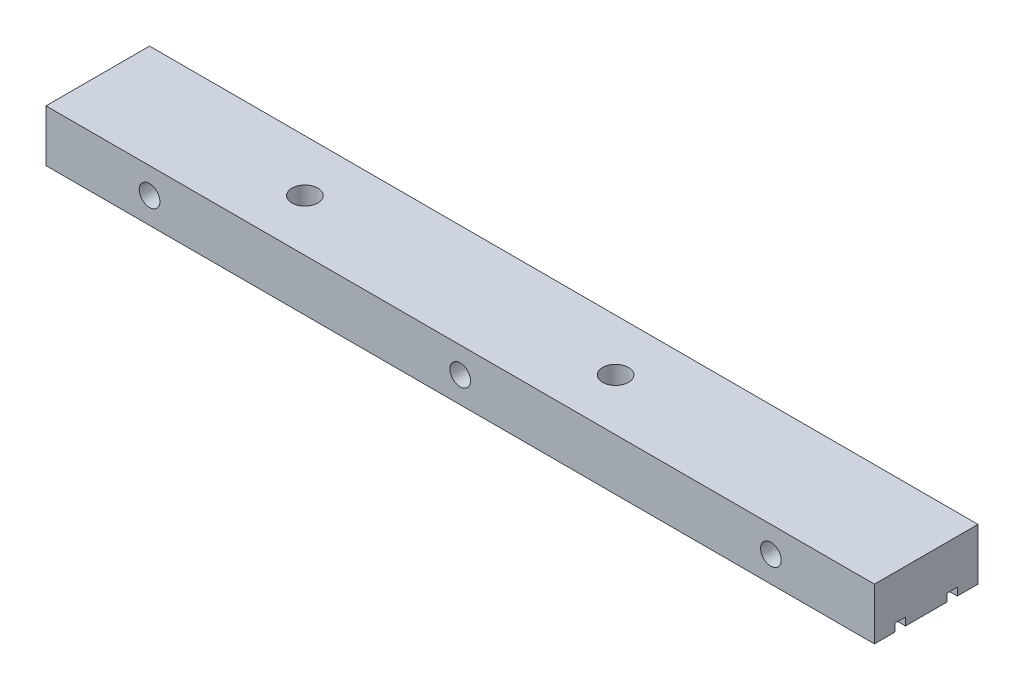
ISO-10303-21;
HEADER;
FILE_DESCRIPTION(('STEP AP214'),'2;1');
FILE_NAME('part.step','',(''),(''),'','','');
FILE_SCHEMA(('AUTOMOTIVE_DESIGN { 1 0 10303 214 1 1 1 1 }'));
ENDSEC;
DATA;
#1=APPLICATION_CONTEXT('core data for automotive mechanical design processes');
#2=APPLICATION_PROTOCOL_DEFINITION('international standard','automotive_design',2000,#1);
#3=PRODUCT_CONTEXT('',#1,'mechanical');
#4=PRODUCT('Part','Part','',(#3));
#5=PRODUCT_RELATED_PRODUCT_CATEGORY('part','',(#4));
#6=PRODUCT_DEFINITION_FORMATION('','',#4);
#7=PRODUCT_DEFINITION_CONTEXT('part definition',#1,'design');
#8=PRODUCT_DEFINITION('design','',#6,#7);
#9=PRODUCT_DEFINITION_SHAPE('','',#8);
#10=(LENGTH_UNIT() NAMED_UNIT(*) SI_UNIT(.MILLI.,.METRE.));
#11=(NAMED_UNIT(*) PLANE_ANGLE_UNIT() SI_UNIT($,.RADIAN.));
#12=(NAMED_UNIT(*) SI_UNIT($,.STERADIAN.) SOLID_ANGLE_UNIT());
#13=UNCERTAINTY_MEASURE_WITH_UNIT(LENGTH_MEASURE(1.E-05),#10,'distance_accuracy_value','');
#14=(GEOMETRIC_REPRESENTATION_CONTEXT(3) GLOBAL_UNCERTAINTY_ASSIGNED_CONTEXT((#13)) GLOBAL_UNIT_ASSIGNED_CONTEXT((#10,
#11,#12)) REPRESENTATION_CONTEXT('',''));
#15=CARTESIAN_POINT('',(0.,0.,0.));
#16=DIRECTION('',(0.,0.,1.));
#17=DIRECTION('',(1.,0.,0.));
#18=AXIS2_PLACEMENT_3D('',#15,#16,#17);
#19=CARTESIAN_POINT('',(0.,0.,20.));
#20=DIRECTION('',(0.,1.,0.));
#21=DIRECTION('',(0.,0.,1.));
#22=AXIS2_PLACEMENT_3D('',#19,#20,#21);
#23=PLANE('',#22);
#24=DIRECTION('',(0.,0.,-1.));
#25=VECTOR('',#24,1.);
#26=CARTESIAN_POINT('',(160.,0.,20.));
#27=LINE('',#26,#25);
#28=CARTESIAN_POINT('',(160.,0.,4.));
#29=VERTEX_POINT('',#28);
#30=CARTESIAN_POINT('',(160.,0.,0.));
#31=VERTEX_POINT('',#30);
#32=EDGE_CURVE('E140',#29,#31,#27,.T.);
#33=ORIENTED_EDGE('',*,*,#32,.F.);
#34=DIRECTION('',(-1.,0.,0.));
#35=VECTOR('',#34,1.);
#36=CARTESIAN_POINT('',(160.,0.,4.));
#37=LINE('',#36,#35);
#38=CARTESIAN_POINT('',(0.,0.,4.));
#39=VERTEX_POINT('',#38);
#40=EDGE_CURVE('E127',#29,#39,#37,.T.);
#41=ORIENTED_EDGE('',*,*,#40,.T.);
#42=DIRECTION('',(0.,0.,-1.));
#43=VECTOR('',#42,1.);
#44=CARTESIAN_POINT('',(0.,0.,20.));
#45=LINE('',#44,#43);
#46=CARTESIAN_POINT('',(0.,0.,0.));
#47=VERTEX_POINT('',#46);
#48=EDGE_CURVE('E46',#39,#47,#45,.T.);
#49=ORIENTED_EDGE('',*,*,#48,.T.);
#50=DIRECTION('',(1.,0.,0.));
#51=VECTOR('',#50,1.);
#52=CARTESIAN_POINT('',(0.,0.,0.));
#53=LINE('',#52,#51);
#54=EDGE_CURVE('E147',#47,#31,#53,.T.);
#55=ORIENTED_EDGE('',*,*,#54,.T.);
#56=EDGE_LOOP('',(#33,#41,#49,#55));
#57=FACE_BOUND('',#56,.T.);
#58=ADVANCED_FACE('F37',(#57),#23,.F.);
#59=CARTESIAN_POINT('',(0.,0.,14.));
#60=VERTEX_POINT('',#59);
#61=CARTESIAN_POINT('',(0.,0.,6.));
#62=VERTEX_POINT('',#61);
#63=EDGE_CURVE('E45',#60,#62,#45,.T.);
#64=ORIENTED_EDGE('',*,*,#63,.T.);
#65=DIRECTION('',(-1.,0.,0.));
#66=VECTOR('',#65,1.);
#67=CARTESIAN_POINT('',(160.,0.,6.));
#68=LINE('',#67,#66);
#69=CARTESIAN_POINT('',(160.,0.,6.));
#70=VERTEX_POINT('',#69);
#71=EDGE_CURVE('E136',#70,#62,#68,.T.);
#72=ORIENTED_EDGE('',*,*,#71,.F.);
#73=CARTESIAN_POINT('',(160.,0.,14.));
#74=VERTEX_POINT('',#73);
#75=EDGE_CURVE('E149',#74,#70,#27,.T.);
#76=ORIENTED_EDGE('',*,*,#75,.F.);
#77=DIRECTION('',(-1.,0.,0.));
#78=VECTOR('',#77,1.);
#79=CARTESIAN_POINT('',(160.,0.,14.));
#80=LINE('',#79,#78);
#81=EDGE_CURVE('E167',#74,#60,#80,.T.);
#82=ORIENTED_EDGE('',*,*,#81,.T.);
#83=EDGE_LOOP('',(#64,#72,#76,#82));
#84=FACE_BOUND('',#83,.T.);
#85=ADVANCED_FACE('F165',(#84),#23,.F.);
#86=CARTESIAN_POINT('',(0.,0.,20.));
#87=DIRECTION('',(1.,0.,0.));
#88=DIRECTION('',(0.,0.,-1.));
#89=AXIS2_PLACEMENT_3D('',#86,#87,#88);
#90=PLANE('',#89);
#91=ORIENTED_EDGE('',*,*,#48,.F.);
#92=DIRECTION('',(0.,-1.,0.));
#93=VECTOR('',#92,1.);
#94=CARTESIAN_POINT('',(0.,0.,4.));
#95=LINE('',#94,#93);
#96=CARTESIAN_POINT('',(0.,1.5,4.));
#97=VERTEX_POINT('',#96);
#98=EDGE_CURVE('E132',#97,#39,#95,.T.);
#99=ORIENTED_EDGE('',*,*,#98,.F.);
#100=DIRECTION('',(0.,0.,-1.));
#101=VECTOR('',#100,1.);
#102=CARTESIAN_POINT('',(0.,1.5,4.));
#103=LINE('',#102,#101);
#104=CARTESIAN_POINT('',(0.,1.5,6.));
#105=VERTEX_POINT('',#104);
#106=EDGE_CURVE('E144',#105,#97,#103,.T.);
#107=ORIENTED_EDGE('',*,*,#106,.F.);
#108=DIRECTION('',(0.,1.,0.));
#109=VECTOR('',#108,1.);
#110=CARTESIAN_POINT('',(0.,0.,6.));
#111=LINE('',#110,#109);
#112=EDGE_CURVE('E175',#62,#105,#111,.T.);
#113=ORIENTED_EDGE('',*,*,#112,.F.);
#114=ORIENTED_EDGE('',*,*,#63,.F.);
#115=DIRECTION('',(0.,-1.,0.));
#116=VECTOR('',#115,1.);
#117=CARTESIAN_POINT('',(0.,0.,14.));
#118=LINE('',#117,#116);
#119=CARTESIAN_POINT('',(0.,1.5,14.));
#120=VERTEX_POINT('',#119);
#121=EDGE_CURVE('E172',#120,#60,#118,.T.);
#122=ORIENTED_EDGE('',*,*,#121,.F.);
#123=DIRECTION('',(0.,0.,-1.));
#124=VECTOR('',#123,1.);
#125=CARTESIAN_POINT('',(0.,1.5,14.));
#126=LINE('',#125,#124);
#127=CARTESIAN_POINT('',(0.,1.5,16.));
#128=VERTEX_POINT('',#127);
#129=EDGE_CURVE('E194',#128,#120,#126,.T.);
#130=ORIENTED_EDGE('',*,*,#129,.F.);
#131=DIRECTION('',(0.,1.,0.));
#132=VECTOR('',#131,1.);
#133=CARTESIAN_POINT('',(0.,0.,16.));
#134=LINE('',#133,#132);
#135=CARTESIAN_POINT('',(0.,0.,16.));
#136=VERTEX_POINT('',#135);
#137=EDGE_CURVE('E198',#136,#128,#134,.T.);
#138=ORIENTED_EDGE('',*,*,#137,.F.);
#139=CARTESIAN_POINT('',(0.,0.,20.));
#140=VERTEX_POINT('',#139);
#141=EDGE_CURVE('E11',#140,#136,#45,.T.);
#142=ORIENTED_EDGE('',*,*,#141,.F.);
#143=DIRECTION('',(0.,-1.,0.));
#144=VECTOR('',#143,1.);
#145=CARTESIAN_POINT('',(0.,0.,20.));
#146=LINE('',#145,#144);
#147=CARTESIAN_POINT('',(0.,10.,20.));
#148=VERTEX_POINT('',#147);
#149=EDGE_CURVE('E222',#148,#140,#146,.T.);
#150=ORIENTED_EDGE('',*,*,#149,.F.);
#151=DIRECTION('',(0.,0.,-1.));
#152=VECTOR('',#151,1.);
#153=CARTESIAN_POINT('',(0.,10.,20.));
#154=LINE('',#153,#152);
#155=CARTESIAN_POINT('',(0.,10.,0.));
#156=VERTEX_POINT('',#155);
#157=EDGE_CURVE('E154',#148,#156,#154,.T.);
#158=ORIENTED_EDGE('',*,*,#157,.T.);
#159=DIRECTION('',(0.,-1.,0.));
#160=VECTOR('',#159,1.);
#161=CARTESIAN_POINT('',(0.,0.,0.));
#162=LINE('',#161,#160);
#163=EDGE_CURVE('E221',#156,#47,#162,.T.);
#164=ORIENTED_EDGE('',*,*,#163,.T.);
#165=EDGE_LOOP('',(#91,#99,#107,#113,#114,#122,#130,#138,#142,#150,#158,#164));
#166=FACE_BOUND('',#165,.T.);
#167=ADVANCED_FACE('F39',(#166),#90,.F.);
#168=ORIENTED_EDGE('',*,*,#141,.T.);
#169=DIRECTION('',(-1.,0.,0.));
#170=VECTOR('',#169,1.);
#171=CARTESIAN_POINT('',(160.,0.,16.));
#172=LINE('',#171,#170);
#173=CARTESIAN_POINT('',(160.,0.,16.));
#174=VERTEX_POINT('',#173);
#175=EDGE_CURVE('E207',#174,#136,#172,.T.);
#176=ORIENTED_EDGE('',*,*,#175,.F.);
#177=CARTESIAN_POINT('',(160.,0.,20.));
#178=VERTEX_POINT('',#177);
#179=EDGE_CURVE('E151',#178,#174,#27,.T.);
#180=ORIENTED_EDGE('',*,*,#179,.F.);
#181=DIRECTION('',(1.,0.,0.));
#182=VECTOR('',#181,1.);
#183=CARTESIAN_POINT('',(0.,0.,20.));
#184=LINE('',#183,#182);
#185=EDGE_CURVE('E225',#140,#178,#184,.T.);
#186=ORIENTED_EDGE('',*,*,#185,.F.);
#187=EDGE_LOOP('',(#168,#176,#180,#186));
#188=FACE_BOUND('',#187,.T.);
#189=ADVANCED_FACE('F254',(#188),#23,.F.);
#190=CARTESIAN_POINT('',(160.,0.,20.));
#191=DIRECTION('',(-1.,0.,0.));
#192=DIRECTION('',(0.,0.,1.));
#193=AXIS2_PLACEMENT_3D('',#190,#191,#192);
#194=PLANE('',#193);
#195=DIRECTION('',(0.,0.,-1.));
#196=VECTOR('',#195,1.);
#197=CARTESIAN_POINT('',(160.,1.5,4.));
#198=LINE('',#197,#196);
#199=CARTESIAN_POINT('',(160.,1.5,6.));
#200=VERTEX_POINT('',#199);
#201=CARTESIAN_POINT('',(160.,1.5,4.));
#202=VERTEX_POINT('',#201);
#203=EDGE_CURVE('E53',#200,#202,#198,.T.);
#204=ORIENTED_EDGE('',*,*,#203,.T.);
#205=DIRECTION('',(0.,-1.,0.));
#206=VECTOR('',#205,1.);
#207=CARTESIAN_POINT('',(160.,0.,4.));
#208=LINE('',#207,#206);
#209=EDGE_CURVE('E130',#202,#29,#208,.T.);
#210=ORIENTED_EDGE('',*,*,#209,.T.);
#211=ORIENTED_EDGE('',*,*,#32,.T.);
#212=DIRECTION('',(0.,1.,0.));
#213=VECTOR('',#212,1.);
#214=CARTESIAN_POINT('',(160.,0.,0.));
#215=LINE('',#214,#213);
#216=CARTESIAN_POINT('',(160.,10.,0.));
#217=VERTEX_POINT('',#216);
#218=EDGE_CURVE('E235',#31,#217,#215,.T.);
#219=ORIENTED_EDGE('',*,*,#218,.T.);
#220=DIRECTION('',(0.,0.,-1.));
#221=VECTOR('',#220,1.);
#222=CARTESIAN_POINT('',(160.,10.,20.));
#223=LINE('',#222,#221);
#224=CARTESIAN_POINT('',(160.,10.,20.));
#225=VERTEX_POINT('',#224);
#226=EDGE_CURVE('E150',#225,#217,#223,.T.);
#227=ORIENTED_EDGE('',*,*,#226,.F.);
#228=DIRECTION('',(0.,1.,0.));
#229=VECTOR('',#228,1.);
#230=CARTESIAN_POINT('',(160.,0.,20.));
#231=LINE('',#230,#229);
#232=EDGE_CURVE('E228',#178,#225,#231,.T.);
#233=ORIENTED_EDGE('',*,*,#232,.F.);
#234=ORIENTED_EDGE('',*,*,#179,.T.);
#235=DIRECTION('',(0.,1.,0.));
#236=VECTOR('',#235,1.);
#237=CARTESIAN_POINT('',(160.,0.,16.));
#238=LINE('',#237,#236);
#239=CARTESIAN_POINT('',(160.,1.5,16.));
#240=VERTEX_POINT('',#239);
#241=EDGE_CURVE('E193',#174,#240,#238,.T.);
#242=ORIENTED_EDGE('',*,*,#241,.T.);
#243=DIRECTION('',(0.,0.,-1.));
#244=VECTOR('',#243,1.);
#245=CARTESIAN_POINT('',(160.,1.5,14.));
#246=LINE('',#245,#244);
#247=CARTESIAN_POINT('',(160.,1.5,14.));
#248=VERTEX_POINT('',#247);
#249=EDGE_CURVE('E61',#240,#248,#246,.T.);
#250=ORIENTED_EDGE('',*,*,#249,.T.);
#251=DIRECTION('',(0.,-1.,0.));
#252=VECTOR('',#251,1.);
#253=CARTESIAN_POINT('',(160.,0.,14.));
#254=LINE('',#253,#252);
#255=EDGE_CURVE('E190',#248,#74,#254,.T.);
#256=ORIENTED_EDGE('',*,*,#255,.T.);
#257=ORIENTED_EDGE('',*,*,#75,.T.);
#258=DIRECTION('',(0.,1.,0.));
#259=VECTOR('',#258,1.);
#260=CARTESIAN_POINT('',(160.,0.,6.));
#261=LINE('',#260,#259);
#262=EDGE_CURVE('E143',#70,#200,#261,.T.);
#263=ORIENTED_EDGE('',*,*,#262,.T.);
#264=EDGE_LOOP('',(#204,#210,#211,#219,#227,#233,#234,#242,#250,#256,#257,#263));
#265=FACE_BOUND('',#264,.T.);
#266=ADVANCED_FACE('F139',(#265),#194,.F.);
#267=CARTESIAN_POINT('',(0.,10.,20.));
#268=DIRECTION('',(0.,-1.,0.));
#269=DIRECTION('',(0.,0.,-1.));
#270=AXIS2_PLACEMENT_3D('',#267,#268,#269);
#271=PLANE('',#270);
#272=CARTESIAN_POINT('',(40.,9.99999999999999,10.));
#273=DIRECTION('',(0.,1.,0.));
#274=DIRECTION('',(0.,0.,1.));
#275=AXIS2_PLACEMENT_3D('',#272,#273,#274);
#276=CIRCLE('',#275,2.5);
#277=CARTESIAN_POINT('',(40.,9.99999999999999,12.5));
#278=VERTEX_POINT('',#277);
#279=EDGE_CURVE('E186',#278,#278,#276,.T.);
#280=ORIENTED_EDGE('',*,*,#279,.F.);
#281=EDGE_LOOP('',(#280));
#282=FACE_BOUND('',#281,.T.);
#283=CARTESIAN_POINT('',(100.,9.99999999999999,10.));
#284=DIRECTION('',(0.,1.,0.));
#285=DIRECTION('',(0.,0.,1.));
#286=AXIS2_PLACEMENT_3D('',#283,#284,#285);
#287=CIRCLE('',#286,2.5);
#288=CARTESIAN_POINT('',(100.,9.99999999999999,12.5));
#289=VERTEX_POINT('',#288);
#290=EDGE_CURVE('E215',#289,#289,#287,.T.);
#291=ORIENTED_EDGE('',*,*,#290,.F.);
#292=EDGE_LOOP('',(#291));
#293=FACE_BOUND('',#292,.T.);
#294=DIRECTION('',(-1.,0.,0.));
#295=VECTOR('',#294,1.);
#296=CARTESIAN_POINT('',(0.,10.,0.));
#297=LINE('',#296,#295);
#298=EDGE_CURVE('E226',#217,#156,#297,.T.);
#299=ORIENTED_EDGE('',*,*,#298,.T.);
#300=ORIENTED_EDGE('',*,*,#157,.F.);
#301=DIRECTION('',(-1.,0.,0.));
#302=VECTOR('',#301,1.);
#303=CARTESIAN_POINT('',(0.,10.,20.));
#304=LINE('',#303,#302);
#305=EDGE_CURVE('E230',#225,#148,#304,.T.);
#306=ORIENTED_EDGE('',*,*,#305,.F.);
#307=ORIENTED_EDGE('',*,*,#226,.T.);
#308=EDGE_LOOP('',(#299,#300,#306,#307));
#309=FACE_BOUND('',#308,.T.);
#310=ADVANCED_FACE('F249',(#282,#293,#309),#271,.F.);
#311=CARTESIAN_POINT('',(0.,0.,20.));
#312=DIRECTION('',(0.,0.,-1.));
#313=DIRECTION('',(-1.,0.,0.));
#314=AXIS2_PLACEMENT_3D('',#311,#312,#313);
#315=PLANE('',#314);
#316=CARTESIAN_POINT('',(140.,5.,20.));
#317=DIRECTION('',(0.,0.,-1.));
#318=DIRECTION('',(-1.,0.,0.));
#319=AXIS2_PLACEMENT_3D('',#316,#317,#318);
#320=CIRCLE('',#319,2.);
#321=CARTESIAN_POINT('',(138.,5.,20.));
#322=VERTEX_POINT('',#321);
#323=EDGE_CURVE('E530',#322,#322,#320,.T.);
#324=ORIENTED_EDGE('',*,*,#323,.T.);
#325=EDGE_LOOP('',(#324));
#326=FACE_BOUND('',#325,.T.);
#327=CARTESIAN_POINT('',(80.,5.,20.));
#328=DIRECTION('',(0.,0.,-1.));
#329=DIRECTION('',(-1.,0.,0.));
#330=AXIS2_PLACEMENT_3D('',#327,#328,#329);
#331=CIRCLE('',#330,1.99999999999999);
#332=CARTESIAN_POINT('',(78.,5.,20.));
#333=VERTEX_POINT('',#332);
#334=EDGE_CURVE('E518',#333,#333,#331,.T.);
#335=ORIENTED_EDGE('',*,*,#334,.T.);
#336=EDGE_LOOP('',(#335));
#337=FACE_BOUND('',#336,.T.);
#338=CARTESIAN_POINT('',(20.,5.,20.));
#339=DIRECTION('',(0.,0.,-1.));
#340=DIRECTION('',(-1.,0.,0.));
#341=AXIS2_PLACEMENT_3D('',#338,#339,#340);
#342=CIRCLE('',#341,1.99999999999999);
#343=CARTESIAN_POINT('',(18.,5.,20.));
#344=VERTEX_POINT('',#343);
#345=EDGE_CURVE('E199',#344,#344,#342,.T.);
#346=ORIENTED_EDGE('',*,*,#345,.T.);
#347=EDGE_LOOP('',(#346));
#348=FACE_BOUND('',#347,.T.);
#349=ORIENTED_EDGE('',*,*,#149,.T.);
#350=ORIENTED_EDGE('',*,*,#185,.T.);
#351=ORIENTED_EDGE('',*,*,#232,.T.);
#352=ORIENTED_EDGE('',*,*,#305,.T.);
#353=EDGE_LOOP('',(#349,#350,#351,#352));
#354=FACE_BOUND('',#353,.T.);
#355=ADVANCED_FACE('F251',(#326,#337,#348,#354),#315,.F.);
#356=CARTESIAN_POINT('',(0.,0.,0.));
#357=DIRECTION('',(0.,0.,-1.));
#358=DIRECTION('',(-1.,0.,0.));
#359=AXIS2_PLACEMENT_3D('',#356,#357,#358);
#360=PLANE('',#359);
#361=CARTESIAN_POINT('',(140.,5.,0.));
#362=DIRECTION('',(0.,0.,-1.));
#363=DIRECTION('',(-1.,0.,0.));
#364=AXIS2_PLACEMENT_3D('',#361,#362,#363);
#365=CIRCLE('',#364,3.25);
#366=CARTESIAN_POINT('',(136.75,5.,0.));
#367=VERTEX_POINT('',#366);
#368=EDGE_CURVE('E539',#367,#367,#365,.T.);
#369=ORIENTED_EDGE('',*,*,#368,.F.);
#370=EDGE_LOOP('',(#369));
#371=FACE_BOUND('',#370,.T.);
#372=CARTESIAN_POINT('',(80.,5.,0.));
#373=DIRECTION('',(0.,0.,-1.));
#374=DIRECTION('',(-1.,0.,0.));
#375=AXIS2_PLACEMENT_3D('',#372,#373,#374);
#376=CIRCLE('',#375,3.25);
#377=CARTESIAN_POINT('',(76.75,5.,0.));
#378=VERTEX_POINT('',#377);
#379=EDGE_CURVE('E527',#378,#378,#376,.T.);
#380=ORIENTED_EDGE('',*,*,#379,.F.);
#381=EDGE_LOOP('',(#380));
#382=FACE_BOUND('',#381,.T.);
#383=CARTESIAN_POINT('',(20.,5.,0.));
#384=DIRECTION('',(0.,0.,-1.));
#385=DIRECTION('',(-1.,0.,0.));
#386=AXIS2_PLACEMENT_3D('',#383,#384,#385);
#387=CIRCLE('',#386,3.25);
#388=CARTESIAN_POINT('',(16.75,5.,0.));
#389=VERTEX_POINT('',#388);
#390=EDGE_CURVE('E515',#389,#389,#387,.T.);
#391=ORIENTED_EDGE('',*,*,#390,.F.);
#392=EDGE_LOOP('',(#391));
#393=FACE_BOUND('',#392,.T.);
#394=ORIENTED_EDGE('',*,*,#163,.F.);
#395=ORIENTED_EDGE('',*,*,#298,.F.);
#396=ORIENTED_EDGE('',*,*,#218,.F.);
#397=ORIENTED_EDGE('',*,*,#54,.F.);
#398=EDGE_LOOP('',(#394,#395,#396,#397));
#399=FACE_BOUND('',#398,.T.);
#400=ADVANCED_FACE('F247',(#371,#382,#393,#399),#360,.T.);
#401=CARTESIAN_POINT('',(100.,1.99999999999999,10.));
#402=DIRECTION('',(0.,-1.,0.));
#403=DIRECTION('',(0.,0.,-1.));
#404=AXIS2_PLACEMENT_3D('',#401,#402,#403);
#405=PLANE('',#404);
#406=CARTESIAN_POINT('',(100.,1.99999999999999,10.));
#407=DIRECTION('',(0.,1.,0.));
#408=DIRECTION('',(0.,0.,1.));
#409=AXIS2_PLACEMENT_3D('',#406,#407,#408);
#410=CIRCLE('',#409,2.5);
#411=CARTESIAN_POINT('',(100.,1.99999999999999,12.5));
#412=VERTEX_POINT('',#411);
#413=EDGE_CURVE('E218',#412,#412,#410,.T.);
#414=ORIENTED_EDGE('',*,*,#413,.T.);
#415=EDGE_LOOP('',(#414));
#416=FACE_BOUND('',#415,.T.);
#417=ADVANCED_FACE('F320',(#416),#405,.F.);
#418=CARTESIAN_POINT('',(100.,9.99999999999999,10.));
#419=DIRECTION('',(0.,1.,0.));
#420=DIRECTION('',(0.,0.,1.));
#421=AXIS2_PLACEMENT_3D('',#418,#419,#420);
#422=CYLINDRICAL_SURFACE('',#421,2.5);
#423=ORIENTED_EDGE('',*,*,#413,.F.);
#424=EDGE_LOOP('',(#423));
#425=FACE_BOUND('',#424,.T.);
#426=ORIENTED_EDGE('',*,*,#290,.T.);
#427=EDGE_LOOP('',(#426));
#428=FACE_BOUND('',#427,.T.);
#429=ADVANCED_FACE('F310',(#425,#428),#422,.F.);
#430=CARTESIAN_POINT('',(40.,1.99999999999999,10.));
#431=DIRECTION('',(0.,-1.,0.));
#432=DIRECTION('',(0.,0.,-1.));
#433=AXIS2_PLACEMENT_3D('',#430,#431,#432);
#434=PLANE('',#433);
#435=CARTESIAN_POINT('',(40.,1.99999999999999,10.));
#436=DIRECTION('',(0.,1.,0.));
#437=DIRECTION('',(0.,0.,1.));
#438=AXIS2_PLACEMENT_3D('',#435,#436,#437);
#439=CIRCLE('',#438,2.5);
#440=CARTESIAN_POINT('',(40.,1.99999999999999,12.5));
#441=VERTEX_POINT('',#440);
#442=EDGE_CURVE('E212',#441,#441,#439,.T.);
#443=ORIENTED_EDGE('',*,*,#442,.T.);
#444=EDGE_LOOP('',(#443));
#445=FACE_BOUND('',#444,.T.);
#446=ADVANCED_FACE('F270',(#445),#434,.F.);
#447=CARTESIAN_POINT('',(40.,9.99999999999999,10.));
#448=DIRECTION('',(0.,1.,0.));
#449=DIRECTION('',(0.,0.,1.));
#450=AXIS2_PLACEMENT_3D('',#447,#448,#449);
#451=CYLINDRICAL_SURFACE('',#450,2.5);
#452=ORIENTED_EDGE('',*,*,#442,.F.);
#453=EDGE_LOOP('',(#452));
#454=FACE_BOUND('',#453,.T.);
#455=ORIENTED_EDGE('',*,*,#279,.T.);
#456=EDGE_LOOP('',(#455));
#457=FACE_BOUND('',#456,.T.);
#458=ADVANCED_FACE('F263',(#454,#457),#451,.F.);
#459=CARTESIAN_POINT('',(160.,0.,14.));
#460=DIRECTION('',(0.,0.,-1.));
#461=DIRECTION('',(-1.,0.,0.));
#462=AXIS2_PLACEMENT_3D('',#459,#460,#461);
#463=PLANE('',#462);
#464=ORIENTED_EDGE('',*,*,#121,.T.);
#465=ORIENTED_EDGE('',*,*,#81,.F.);
#466=ORIENTED_EDGE('',*,*,#255,.F.);
#467=DIRECTION('',(-1.,0.,0.));
#468=VECTOR('',#467,1.);
#469=CARTESIAN_POINT('',(160.,1.5,14.));
#470=LINE('',#469,#468);
#471=EDGE_CURVE('E180',#248,#120,#470,.T.);
#472=ORIENTED_EDGE('',*,*,#471,.T.);
#473=EDGE_LOOP('',(#464,#465,#466,#472));
#474=FACE_BOUND('',#473,.T.);
#475=ADVANCED_FACE('F261',(#474),#463,.F.);
#476=CARTESIAN_POINT('',(160.,1.5,14.));
#477=DIRECTION('',(0.,1.,0.));
#478=DIRECTION('',(0.,0.,1.));
#479=AXIS2_PLACEMENT_3D('',#476,#477,#478);
#480=PLANE('',#479);
#481=ORIENTED_EDGE('',*,*,#129,.T.);
#482=ORIENTED_EDGE('',*,*,#471,.F.);
#483=ORIENTED_EDGE('',*,*,#249,.F.);
#484=DIRECTION('',(-1.,0.,0.));
#485=VECTOR('',#484,1.);
#486=CARTESIAN_POINT('',(160.,1.5,16.));
#487=LINE('',#486,#485);
#488=EDGE_CURVE('E205',#240,#128,#487,.T.);
#489=ORIENTED_EDGE('',*,*,#488,.T.);
#490=EDGE_LOOP('',(#481,#482,#483,#489));
#491=FACE_BOUND('',#490,.T.);
#492=ADVANCED_FACE('F258',(#491),#480,.F.);
#493=CARTESIAN_POINT('',(160.,0.,16.));
#494=DIRECTION('',(0.,0.,1.));
#495=DIRECTION('',(1.,0.,0.));
#496=AXIS2_PLACEMENT_3D('',#493,#494,#495);
#497=PLANE('',#496);
#498=ORIENTED_EDGE('',*,*,#137,.T.);
#499=ORIENTED_EDGE('',*,*,#488,.F.);
#500=ORIENTED_EDGE('',*,*,#241,.F.);
#501=ORIENTED_EDGE('',*,*,#175,.T.);
#502=EDGE_LOOP('',(#498,#499,#500,#501));
#503=FACE_BOUND('',#502,.T.);
#504=ADVANCED_FACE('F257',(#503),#497,.F.);
#505=CARTESIAN_POINT('',(160.,0.,4.));
#506=DIRECTION('',(0.,0.,-1.));
#507=DIRECTION('',(0.,1.,0.));
#508=AXIS2_PLACEMENT_3D('',#505,#506,#507);
#509=PLANE('',#508);
#510=ORIENTED_EDGE('',*,*,#98,.T.);
#511=ORIENTED_EDGE('',*,*,#40,.F.);
#512=ORIENTED_EDGE('',*,*,#209,.F.);
#513=DIRECTION('',(-1.,0.,0.));
#514=VECTOR('',#513,1.);
#515=CARTESIAN_POINT('',(160.,1.5,4.));
#516=LINE('',#515,#514);
#517=EDGE_CURVE('E184',#202,#97,#516,.T.);
#518=ORIENTED_EDGE('',*,*,#517,.T.);
#519=EDGE_LOOP('',(#510,#511,#512,#518));
#520=FACE_BOUND('',#519,.T.);
#521=ADVANCED_FACE('F129',(#520),#509,.F.);
#522=CARTESIAN_POINT('',(160.,1.5,4.));
#523=DIRECTION('',(0.,1.,0.));
#524=DIRECTION('',(0.,0.,1.));
#525=AXIS2_PLACEMENT_3D('',#522,#523,#524);
#526=PLANE('',#525);
#527=ORIENTED_EDGE('',*,*,#106,.T.);
#528=ORIENTED_EDGE('',*,*,#517,.F.);
#529=ORIENTED_EDGE('',*,*,#203,.F.);
#530=DIRECTION('',(-1.,0.,0.));
#531=VECTOR('',#530,1.);
#532=CARTESIAN_POINT('',(160.,1.5,6.));
#533=LINE('',#532,#531);
#534=EDGE_CURVE('E187',#200,#105,#533,.T.);
#535=ORIENTED_EDGE('',*,*,#534,.T.);
#536=EDGE_LOOP('',(#527,#528,#529,#535));
#537=FACE_BOUND('',#536,.T.);
#538=ADVANCED_FACE('F459',(#537),#526,.F.);
#539=CARTESIAN_POINT('',(160.,0.,6.));
#540=DIRECTION('',(0.,0.,1.));
#541=DIRECTION('',(0.,-1.,0.));
#542=AXIS2_PLACEMENT_3D('',#539,#540,#541);
#543=PLANE('',#542);
#544=ORIENTED_EDGE('',*,*,#112,.T.);
#545=ORIENTED_EDGE('',*,*,#534,.F.);
#546=ORIENTED_EDGE('',*,*,#262,.F.);
#547=ORIENTED_EDGE('',*,*,#71,.T.);
#548=EDGE_LOOP('',(#544,#545,#546,#547));
#549=FACE_BOUND('',#548,.T.);
#550=ADVANCED_FACE('F370',(#549),#543,.F.);
#551=CARTESIAN_POINT('',(20.,5.,0.));
#552=DIRECTION('',(0.,0.,-1.));
#553=DIRECTION('',(-1.,0.,0.));
#554=AXIS2_PLACEMENT_3D('',#551,#552,#553);
#555=CYLINDRICAL_SURFACE('',#554,2.);
#556=ORIENTED_EDGE('',*,*,#345,.F.);
#557=EDGE_LOOP('',(#556));
#558=FACE_BOUND('',#557,.T.);
#559=CARTESIAN_POINT('',(20.,5.,6.));
#560=DIRECTION('',(0.,0.,-1.));
#561=DIRECTION('',(-1.,0.,0.));
#562=AXIS2_PLACEMENT_3D('',#559,#560,#561);
#563=CIRCLE('',#562,2.);
#564=CARTESIAN_POINT('',(18.,5.,6.));
#565=VERTEX_POINT('',#564);
#566=EDGE_CURVE('E509',#565,#565,#563,.T.);
#567=ORIENTED_EDGE('',*,*,#566,.T.);
#568=EDGE_LOOP('',(#567));
#569=FACE_BOUND('',#568,.T.);
#570=ADVANCED_FACE('F364',(#558,#569),#555,.F.);
#571=CARTESIAN_POINT('',(22.,5.,6.));
#572=DIRECTION('',(0.,0.,1.));
#573=DIRECTION('',(1.,0.,0.));
#574=AXIS2_PLACEMENT_3D('',#571,#572,#573);
#575=PLANE('',#574);
#576=ORIENTED_EDGE('',*,*,#566,.F.);
#577=EDGE_LOOP('',(#576));
#578=FACE_BOUND('',#577,.T.);
#579=CARTESIAN_POINT('',(20.,5.,6.));
#580=DIRECTION('',(0.,0.,-1.));
#581=DIRECTION('',(-1.,0.,0.));
#582=AXIS2_PLACEMENT_3D('',#579,#580,#581);
#583=CIRCLE('',#582,3.25);
#584=CARTESIAN_POINT('',(16.75,5.,6.));
#585=VERTEX_POINT('',#584);
#586=EDGE_CURVE('E512',#585,#585,#583,.T.);
#587=ORIENTED_EDGE('',*,*,#586,.T.);
#588=EDGE_LOOP('',(#587));
#589=FACE_BOUND('',#588,.T.);
#590=ADVANCED_FACE('F369',(#578,#589),#575,.F.);
#591=CARTESIAN_POINT('',(20.,5.,0.));
#592=DIRECTION('',(0.,0.,-1.));
#593=DIRECTION('',(-1.,0.,0.));
#594=AXIS2_PLACEMENT_3D('',#591,#592,#593);
#595=CYLINDRICAL_SURFACE('',#594,3.25);
#596=ORIENTED_EDGE('',*,*,#586,.F.);
#597=EDGE_LOOP('',(#596));
#598=FACE_BOUND('',#597,.T.);
#599=ORIENTED_EDGE('',*,*,#390,.T.);
#600=EDGE_LOOP('',(#599));
#601=FACE_BOUND('',#600,.T.);
#602=ADVANCED_FACE('F382',(#598,#601),#595,.F.);
#603=CARTESIAN_POINT('',(80.,5.,0.));
#604=DIRECTION('',(0.,0.,-1.));
#605=DIRECTION('',(-1.,0.,0.));
#606=AXIS2_PLACEMENT_3D('',#603,#604,#605);
#607=CYLINDRICAL_SURFACE('',#606,1.99999999999999);
#608=ORIENTED_EDGE('',*,*,#334,.F.);
#609=EDGE_LOOP('',(#608));
#610=FACE_BOUND('',#609,.T.);
#611=CARTESIAN_POINT('',(80.,5.,6.));
#612=DIRECTION('',(0.,0.,-1.));
#613=DIRECTION('',(-1.,0.,0.));
#614=AXIS2_PLACEMENT_3D('',#611,#612,#613);
#615=CIRCLE('',#614,2.);
#616=CARTESIAN_POINT('',(78.,5.,6.));
#617=VERTEX_POINT('',#616);
#618=EDGE_CURVE('E521',#617,#617,#615,.T.);
#619=ORIENTED_EDGE('',*,*,#618,.T.);
#620=EDGE_LOOP('',(#619));
#621=FACE_BOUND('',#620,.T.);
#622=ADVANCED_FACE('F392',(#610,#621),#607,.F.);
#623=CARTESIAN_POINT('',(82.,5.,6.));
#624=DIRECTION('',(0.,0.,1.));
#625=DIRECTION('',(1.,0.,0.));
#626=AXIS2_PLACEMENT_3D('',#623,#624,#625);
#627=PLANE('',#626);
#628=ORIENTED_EDGE('',*,*,#618,.F.);
#629=EDGE_LOOP('',(#628));
#630=FACE_BOUND('',#629,.T.);
#631=CARTESIAN_POINT('',(80.,5.,6.));
#632=DIRECTION('',(0.,0.,-1.));
#633=DIRECTION('',(-1.,0.,0.));
#634=AXIS2_PLACEMENT_3D('',#631,#632,#633);
#635=CIRCLE('',#634,3.25);
#636=CARTESIAN_POINT('',(76.75,5.,6.));
#637=VERTEX_POINT('',#636);
#638=EDGE_CURVE('E524',#637,#637,#635,.T.);
#639=ORIENTED_EDGE('',*,*,#638,.T.);
#640=EDGE_LOOP('',(#639));
#641=FACE_BOUND('',#640,.T.);
#642=ADVANCED_FACE('F402',(#630,#641),#627,.F.);
#643=CARTESIAN_POINT('',(80.,5.,0.));
#644=DIRECTION('',(0.,0.,-1.));
#645=DIRECTION('',(-1.,0.,0.));
#646=AXIS2_PLACEMENT_3D('',#643,#644,#645);
#647=CYLINDRICAL_SURFACE('',#646,3.25);
#648=ORIENTED_EDGE('',*,*,#638,.F.);
#649=EDGE_LOOP('',(#648));
#650=FACE_BOUND('',#649,.T.);
#651=ORIENTED_EDGE('',*,*,#379,.T.);
#652=EDGE_LOOP('',(#651));
#653=FACE_BOUND('',#652,.T.);
#654=ADVANCED_FACE('F412',(#650,#653),#647,.F.);
#655=CARTESIAN_POINT('',(140.,5.,0.));
#656=DIRECTION('',(0.,0.,-1.));
#657=DIRECTION('',(-1.,0.,0.));
#658=AXIS2_PLACEMENT_3D('',#655,#656,#657);
#659=CYLINDRICAL_SURFACE('',#658,2.);
#660=ORIENTED_EDGE('',*,*,#323,.F.);
#661=EDGE_LOOP('',(#660));
#662=FACE_BOUND('',#661,.T.);
#663=CARTESIAN_POINT('',(140.,5.,6.));
#664=DIRECTION('',(0.,0.,-1.));
#665=DIRECTION('',(-1.,0.,0.));
#666=AXIS2_PLACEMENT_3D('',#663,#664,#665);
#667=CIRCLE('',#666,2.);
#668=CARTESIAN_POINT('',(138.,5.,6.));
#669=VERTEX_POINT('',#668);
#670=EDGE_CURVE('E533',#669,#669,#667,.T.);
#671=ORIENTED_EDGE('',*,*,#670,.T.);
#672=EDGE_LOOP('',(#671));
#673=FACE_BOUND('',#672,.T.);
#674=ADVANCED_FACE('F422',(#662,#673),#659,.F.);
#675=CARTESIAN_POINT('',(142.,5.,6.));
#676=DIRECTION('',(0.,0.,1.));
#677=DIRECTION('',(1.,0.,0.));
#678=AXIS2_PLACEMENT_3D('',#675,#676,#677);
#679=PLANE('',#678);
#680=ORIENTED_EDGE('',*,*,#670,.F.);
#681=EDGE_LOOP('',(#680));
#682=FACE_BOUND('',#681,.T.);
#683=CARTESIAN_POINT('',(140.,5.,6.));
#684=DIRECTION('',(0.,0.,-1.));
#685=DIRECTION('',(-1.,0.,0.));
#686=AXIS2_PLACEMENT_3D('',#683,#684,#685);
#687=CIRCLE('',#686,3.25);
#688=CARTESIAN_POINT('',(136.75,5.,6.));
#689=VERTEX_POINT('',#688);
#690=EDGE_CURVE('E536',#689,#689,#687,.T.);
#691=ORIENTED_EDGE('',*,*,#690,.T.);
#692=EDGE_LOOP('',(#691));
#693=FACE_BOUND('',#692,.T.);
#694=ADVANCED_FACE('F432',(#682,#693),#679,.F.);
#695=CARTESIAN_POINT('',(140.,5.,0.));
#696=DIRECTION('',(0.,0.,-1.));
#697=DIRECTION('',(-1.,0.,0.));
#698=AXIS2_PLACEMENT_3D('',#695,#696,#697);
#699=CYLINDRICAL_SURFACE('',#698,3.25);
#700=ORIENTED_EDGE('',*,*,#690,.F.);
#701=EDGE_LOOP('',(#700));
#702=FACE_BOUND('',#701,.T.);
#703=ORIENTED_EDGE('',*,*,#368,.T.);
#704=EDGE_LOOP('',(#703));
#705=FACE_BOUND('',#704,.T.);
#706=ADVANCED_FACE('F442',(#702,#705),#699,.F.);
#707=CLOSED_SHELL('',(#58,#85,#167,#189,#266,#310,#355,#400,#417,#429,#446,#458,#475,#492,#504,
#521,#538,#550,#570,#590,#602,#622,#642,#654,#674,#694,#706));
#708=MANIFOLD_SOLID_BREP('B2',#707);
#709=ADVANCED_BREP_SHAPE_REPRESENTATION('',(#18,#708),#14);
#710=SHAPE_DEFINITION_REPRESENTATION(#9,#709);
ENDSEC;
END-ISO-10303-21;
